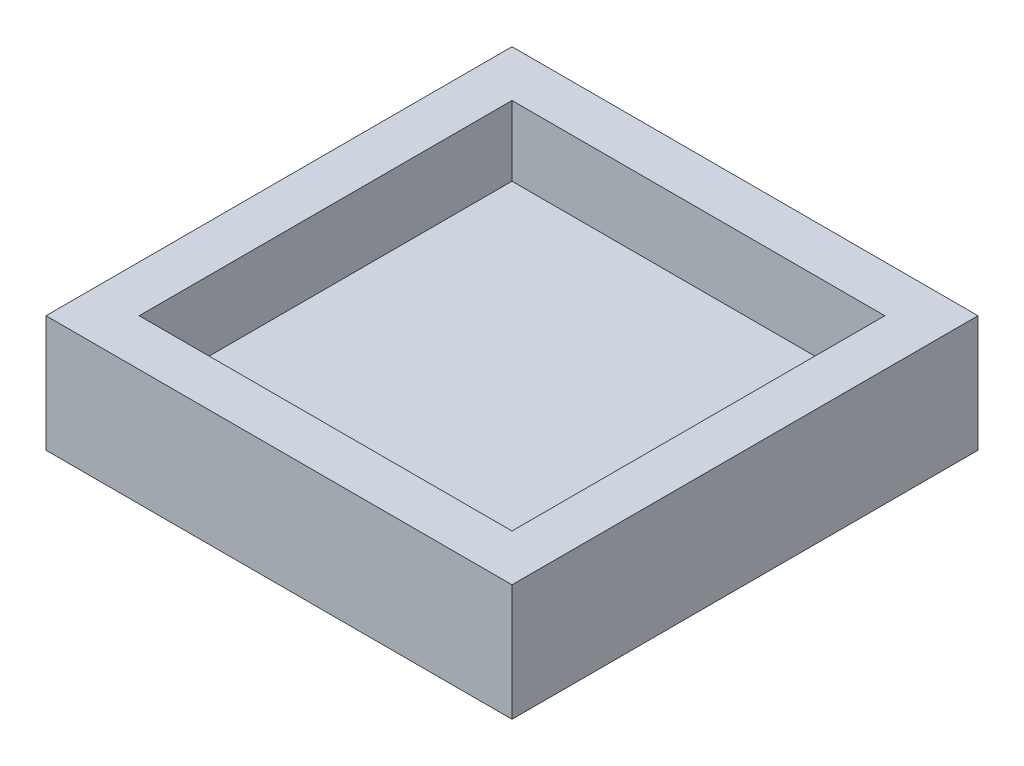
ISO-10303-21;
HEADER;
FILE_DESCRIPTION(('STEP AP214'),'2;1');
FILE_NAME('part.step','',(''),(''),'','','');
FILE_SCHEMA(('AUTOMOTIVE_DESIGN { 1 0 10303 214 1 1 1 1 }'));
ENDSEC;
DATA;
#1=APPLICATION_CONTEXT('core data for automotive mechanical design processes');
#2=APPLICATION_PROTOCOL_DEFINITION('international standard','automotive_design',2000,#1);
#3=PRODUCT_CONTEXT('',#1,'mechanical');
#4=PRODUCT('Part','Part','',(#3));
#5=PRODUCT_RELATED_PRODUCT_CATEGORY('part','',(#4));
#6=PRODUCT_DEFINITION_FORMATION('','',#4);
#7=PRODUCT_DEFINITION_CONTEXT('part definition',#1,'design');
#8=PRODUCT_DEFINITION('design','',#6,#7);
#9=PRODUCT_DEFINITION_SHAPE('','',#8);
#10=(LENGTH_UNIT() NAMED_UNIT(*) SI_UNIT(.MILLI.,.METRE.));
#11=(NAMED_UNIT(*) PLANE_ANGLE_UNIT() SI_UNIT($,.RADIAN.));
#12=(NAMED_UNIT(*) SI_UNIT($,.STERADIAN.) SOLID_ANGLE_UNIT());
#13=UNCERTAINTY_MEASURE_WITH_UNIT(LENGTH_MEASURE(1.E-05),#10,'distance_accuracy_value','');
#14=(GEOMETRIC_REPRESENTATION_CONTEXT(3) GLOBAL_UNCERTAINTY_ASSIGNED_CONTEXT((#13)) GLOBAL_UNIT_ASSIGNED_CONTEXT((#10,
#11,#12)) REPRESENTATION_CONTEXT('',''));
#15=CARTESIAN_POINT('',(0.,0.,0.));
#16=DIRECTION('',(0.,0.,1.));
#17=DIRECTION('',(1.,0.,0.));
#18=AXIS2_PLACEMENT_3D('',#15,#16,#17);
#19=CARTESIAN_POINT('',(0.,6.35,0.));
#20=DIRECTION('',(0.,0.,-1.));
#21=DIRECTION('',(-1.,0.,0.));
#22=AXIS2_PLACEMENT_3D('',#19,#20,#21);
#23=PLANE('',#22);
#24=DIRECTION('',(1.,0.,0.));
#25=VECTOR('',#24,1.);
#26=CARTESIAN_POINT('',(0.,0.,0.));
#27=LINE('',#26,#25);
#28=CARTESIAN_POINT('',(0.,0.,0.));
#29=VERTEX_POINT('',#28);
#30=CARTESIAN_POINT('',(25.4,0.,0.));
#31=VERTEX_POINT('',#30);
#32=EDGE_CURVE('E156',#29,#31,#27,.T.);
#33=ORIENTED_EDGE('',*,*,#32,.T.);
#34=DIRECTION('',(0.,-1.,0.));
#35=VECTOR('',#34,1.);
#36=CARTESIAN_POINT('',(25.4,6.35,0.));
#37=LINE('',#36,#35);
#38=CARTESIAN_POINT('',(25.4,6.35,0.));
#39=VERTEX_POINT('',#38);
#40=EDGE_CURVE('E11',#39,#31,#37,.T.);
#41=ORIENTED_EDGE('',*,*,#40,.F.);
#42=DIRECTION('',(1.,0.,0.));
#43=VECTOR('',#42,1.);
#44=CARTESIAN_POINT('',(0.,6.35,0.));
#45=LINE('',#44,#43);
#46=CARTESIAN_POINT('',(0.,6.35,0.));
#47=VERTEX_POINT('',#46);
#48=EDGE_CURVE('E150',#47,#39,#45,.T.);
#49=ORIENTED_EDGE('',*,*,#48,.F.);
#50=DIRECTION('',(0.,-1.,0.));
#51=VECTOR('',#50,1.);
#52=CARTESIAN_POINT('',(0.,6.35,0.));
#53=LINE('',#52,#51);
#54=EDGE_CURVE('E65',#47,#29,#53,.T.);
#55=ORIENTED_EDGE('',*,*,#54,.T.);
#56=EDGE_LOOP('',(#33,#41,#49,#55));
#57=FACE_BOUND('',#56,.T.);
#58=ADVANCED_FACE('F39',(#57),#23,.F.);
#59=CARTESIAN_POINT('',(25.4,6.35,0.));
#60=DIRECTION('',(-1.,0.,0.));
#61=DIRECTION('',(0.,0.,1.));
#62=AXIS2_PLACEMENT_3D('',#59,#60,#61);
#63=PLANE('',#62);
#64=DIRECTION('',(0.,0.,-1.));
#65=VECTOR('',#64,1.);
#66=CARTESIAN_POINT('',(25.4,0.,0.));
#67=LINE('',#66,#65);
#68=CARTESIAN_POINT('',(25.4,0.,-25.4));
#69=VERTEX_POINT('',#68);
#70=EDGE_CURVE('E158',#31,#69,#67,.T.);
#71=ORIENTED_EDGE('',*,*,#70,.T.);
#72=DIRECTION('',(0.,-1.,0.));
#73=VECTOR('',#72,1.);
#74=CARTESIAN_POINT('',(25.4,6.35,-25.4));
#75=LINE('',#74,#73);
#76=CARTESIAN_POINT('',(25.4,6.35,-25.4));
#77=VERTEX_POINT('',#76);
#78=EDGE_CURVE('E46',#77,#69,#75,.T.);
#79=ORIENTED_EDGE('',*,*,#78,.F.);
#80=DIRECTION('',(0.,0.,-1.));
#81=VECTOR('',#80,1.);
#82=CARTESIAN_POINT('',(25.4,6.35,0.));
#83=LINE('',#82,#81);
#84=EDGE_CURVE('E86',#39,#77,#83,.T.);
#85=ORIENTED_EDGE('',*,*,#84,.F.);
#86=ORIENTED_EDGE('',*,*,#40,.T.);
#87=EDGE_LOOP('',(#71,#79,#85,#86));
#88=FACE_BOUND('',#87,.T.);
#89=ADVANCED_FACE('F175',(#88),#63,.F.);
#90=CARTESIAN_POINT('',(0.,6.35,-25.4));
#91=DIRECTION('',(0.,0.,-1.));
#92=DIRECTION('',(-1.,0.,0.));
#93=AXIS2_PLACEMENT_3D('',#90,#91,#92);
#94=PLANE('',#93);
#95=DIRECTION('',(1.,0.,0.));
#96=VECTOR('',#95,1.);
#97=CARTESIAN_POINT('',(0.,0.,-25.4));
#98=LINE('',#97,#96);
#99=CARTESIAN_POINT('',(0.,0.,-25.4));
#100=VERTEX_POINT('',#99);
#101=EDGE_CURVE('E161',#100,#69,#98,.T.);
#102=ORIENTED_EDGE('',*,*,#101,.F.);
#103=DIRECTION('',(0.,-1.,0.));
#104=VECTOR('',#103,1.);
#105=CARTESIAN_POINT('',(0.,6.35,-25.4));
#106=LINE('',#105,#104);
#107=CARTESIAN_POINT('',(0.,6.35,-25.4));
#108=VERTEX_POINT('',#107);
#109=EDGE_CURVE('E170',#108,#100,#106,.T.);
#110=ORIENTED_EDGE('',*,*,#109,.F.);
#111=DIRECTION('',(1.,0.,0.));
#112=VECTOR('',#111,1.);
#113=CARTESIAN_POINT('',(0.,6.35,-25.4));
#114=LINE('',#113,#112);
#115=EDGE_CURVE('E151',#108,#77,#114,.T.);
#116=ORIENTED_EDGE('',*,*,#115,.T.);
#117=ORIENTED_EDGE('',*,*,#78,.T.);
#118=EDGE_LOOP('',(#102,#110,#116,#117));
#119=FACE_BOUND('',#118,.T.);
#120=ADVANCED_FACE('F168',(#119),#94,.T.);
#121=CARTESIAN_POINT('',(0.,6.35,0.));
#122=DIRECTION('',(-1.,0.,0.));
#123=DIRECTION('',(0.,0.,1.));
#124=AXIS2_PLACEMENT_3D('',#121,#122,#123);
#125=PLANE('',#124);
#126=DIRECTION('',(0.,0.,-1.));
#127=VECTOR('',#126,1.);
#128=CARTESIAN_POINT('',(0.,0.,0.));
#129=LINE('',#128,#127);
#130=EDGE_CURVE('E149',#29,#100,#129,.T.);
#131=ORIENTED_EDGE('',*,*,#130,.F.);
#132=ORIENTED_EDGE('',*,*,#54,.F.);
#133=DIRECTION('',(0.,0.,-1.));
#134=VECTOR('',#133,1.);
#135=CARTESIAN_POINT('',(0.,6.35,0.));
#136=LINE('',#135,#134);
#137=EDGE_CURVE('E152',#47,#108,#136,.T.);
#138=ORIENTED_EDGE('',*,*,#137,.T.);
#139=ORIENTED_EDGE('',*,*,#109,.T.);
#140=EDGE_LOOP('',(#131,#132,#138,#139));
#141=FACE_BOUND('',#140,.T.);
#142=ADVANCED_FACE('F176',(#141),#125,.T.);
#143=CARTESIAN_POINT('',(0.,6.35,0.));
#144=DIRECTION('',(0.,1.,0.));
#145=DIRECTION('',(0.,0.,1.));
#146=AXIS2_PLACEMENT_3D('',#143,#144,#145);
#147=PLANE('',#146);
#148=DIRECTION('',(1.,0.,0.));
#149=VECTOR('',#148,1.);
#150=CARTESIAN_POINT('',(0.,6.35,-2.54));
#151=LINE('',#150,#149);
#152=CARTESIAN_POINT('',(2.54,6.35,-2.54));
#153=VERTEX_POINT('',#152);
#154=CARTESIAN_POINT('',(22.86,6.35,-2.54));
#155=VERTEX_POINT('',#154);
#156=EDGE_CURVE('E137',#153,#155,#151,.T.);
#157=ORIENTED_EDGE('',*,*,#156,.F.);
#158=DIRECTION('',(0.,0.,-1.));
#159=VECTOR('',#158,1.);
#160=CARTESIAN_POINT('',(2.54,6.35,0.));
#161=LINE('',#160,#159);
#162=CARTESIAN_POINT('',(2.54,6.35,-22.86));
#163=VERTEX_POINT('',#162);
#164=EDGE_CURVE('E119',#153,#163,#161,.T.);
#165=ORIENTED_EDGE('',*,*,#164,.T.);
#166=DIRECTION('',(1.,0.,0.));
#167=VECTOR('',#166,1.);
#168=CARTESIAN_POINT('',(0.,6.35,-22.86));
#169=LINE('',#168,#167);
#170=CARTESIAN_POINT('',(22.86,6.35,-22.86));
#171=VERTEX_POINT('',#170);
#172=EDGE_CURVE('E52',#163,#171,#169,.T.);
#173=ORIENTED_EDGE('',*,*,#172,.T.);
#174=DIRECTION('',(0.,0.,-1.));
#175=VECTOR('',#174,1.);
#176=CARTESIAN_POINT('',(22.86,6.35,0.));
#177=LINE('',#176,#175);
#178=EDGE_CURVE('E138',#155,#171,#177,.T.);
#179=ORIENTED_EDGE('',*,*,#178,.F.);
#180=EDGE_LOOP('',(#157,#165,#173,#179));
#181=FACE_BOUND('',#180,.T.);
#182=ORIENTED_EDGE('',*,*,#48,.T.);
#183=ORIENTED_EDGE('',*,*,#84,.T.);
#184=ORIENTED_EDGE('',*,*,#115,.F.);
#185=ORIENTED_EDGE('',*,*,#137,.F.);
#186=EDGE_LOOP('',(#182,#183,#184,#185));
#187=FACE_BOUND('',#186,.T.);
#188=ADVANCED_FACE('F178',(#181,#187),#147,.T.);
#189=CARTESIAN_POINT('',(0.,0.,0.));
#190=DIRECTION('',(0.,1.,0.));
#191=DIRECTION('',(0.,0.,1.));
#192=AXIS2_PLACEMENT_3D('',#189,#190,#191);
#193=PLANE('',#192);
#194=ORIENTED_EDGE('',*,*,#32,.F.);
#195=ORIENTED_EDGE('',*,*,#130,.T.);
#196=ORIENTED_EDGE('',*,*,#101,.T.);
#197=ORIENTED_EDGE('',*,*,#70,.F.);
#198=EDGE_LOOP('',(#194,#195,#196,#197));
#199=FACE_BOUND('',#198,.T.);
#200=ADVANCED_FACE('F173',(#199),#193,.F.);
#201=CARTESIAN_POINT('',(0.,6.35,-2.54));
#202=DIRECTION('',(0.,0.,-1.));
#203=DIRECTION('',(-1.,0.,0.));
#204=AXIS2_PLACEMENT_3D('',#201,#202,#203);
#205=PLANE('',#204);
#206=DIRECTION('',(1.,0.,0.));
#207=VECTOR('',#206,1.);
#208=CARTESIAN_POINT('',(0.,2.54,-2.54));
#209=LINE('',#208,#207);
#210=CARTESIAN_POINT('',(2.54,2.54,-2.54));
#211=VERTEX_POINT('',#210);
#212=CARTESIAN_POINT('',(22.86,2.54,-2.54));
#213=VERTEX_POINT('',#212);
#214=EDGE_CURVE('E125',#211,#213,#209,.T.);
#215=ORIENTED_EDGE('',*,*,#214,.F.);
#216=DIRECTION('',(0.,-1.,0.));
#217=VECTOR('',#216,1.);
#218=CARTESIAN_POINT('',(2.54,6.35,-2.54));
#219=LINE('',#218,#217);
#220=EDGE_CURVE('E115',#153,#211,#219,.T.);
#221=ORIENTED_EDGE('',*,*,#220,.F.);
#222=ORIENTED_EDGE('',*,*,#156,.T.);
#223=DIRECTION('',(0.,-1.,0.));
#224=VECTOR('',#223,1.);
#225=CARTESIAN_POINT('',(22.86,6.35,-2.54));
#226=LINE('',#225,#224);
#227=EDGE_CURVE('E126',#155,#213,#226,.T.);
#228=ORIENTED_EDGE('',*,*,#227,.T.);
#229=EDGE_LOOP('',(#215,#221,#222,#228));
#230=FACE_BOUND('',#229,.T.);
#231=ADVANCED_FACE('F127',(#230),#205,.T.);
#232=CARTESIAN_POINT('',(22.86,6.35,0.));
#233=DIRECTION('',(-1.,0.,0.));
#234=DIRECTION('',(0.,0.,1.));
#235=AXIS2_PLACEMENT_3D('',#232,#233,#234);
#236=PLANE('',#235);
#237=DIRECTION('',(0.,0.,-1.));
#238=VECTOR('',#237,1.);
#239=CARTESIAN_POINT('',(22.86,2.54,0.));
#240=LINE('',#239,#238);
#241=CARTESIAN_POINT('',(22.86,2.54,-22.86));
#242=VERTEX_POINT('',#241);
#243=EDGE_CURVE('E132',#213,#242,#240,.T.);
#244=ORIENTED_EDGE('',*,*,#243,.F.);
#245=ORIENTED_EDGE('',*,*,#227,.F.);
#246=ORIENTED_EDGE('',*,*,#178,.T.);
#247=DIRECTION('',(0.,-1.,0.));
#248=VECTOR('',#247,1.);
#249=CARTESIAN_POINT('',(22.86,6.35,-22.86));
#250=LINE('',#249,#248);
#251=EDGE_CURVE('E271',#171,#242,#250,.T.);
#252=ORIENTED_EDGE('',*,*,#251,.T.);
#253=EDGE_LOOP('',(#244,#245,#246,#252));
#254=FACE_BOUND('',#253,.T.);
#255=ADVANCED_FACE('F201',(#254),#236,.T.);
#256=CARTESIAN_POINT('',(0.,6.35,-22.86));
#257=DIRECTION('',(0.,0.,-1.));
#258=DIRECTION('',(-1.,0.,0.));
#259=AXIS2_PLACEMENT_3D('',#256,#257,#258);
#260=PLANE('',#259);
#261=DIRECTION('',(1.,0.,0.));
#262=VECTOR('',#261,1.);
#263=CARTESIAN_POINT('',(0.,2.54,-22.86));
#264=LINE('',#263,#262);
#265=CARTESIAN_POINT('',(2.54,2.54,-22.86));
#266=VERTEX_POINT('',#265);
#267=EDGE_CURVE('E136',#266,#242,#264,.T.);
#268=ORIENTED_EDGE('',*,*,#267,.T.);
#269=ORIENTED_EDGE('',*,*,#251,.F.);
#270=ORIENTED_EDGE('',*,*,#172,.F.);
#271=DIRECTION('',(0.,-1.,0.));
#272=VECTOR('',#271,1.);
#273=CARTESIAN_POINT('',(2.54,6.35,-22.86));
#274=LINE('',#273,#272);
#275=EDGE_CURVE('E121',#163,#266,#274,.T.);
#276=ORIENTED_EDGE('',*,*,#275,.T.);
#277=EDGE_LOOP('',(#268,#269,#270,#276));
#278=FACE_BOUND('',#277,.T.);
#279=ADVANCED_FACE('F199',(#278),#260,.F.);
#280=CARTESIAN_POINT('',(2.54,6.35,0.));
#281=DIRECTION('',(-1.,0.,0.));
#282=DIRECTION('',(0.,0.,1.));
#283=AXIS2_PLACEMENT_3D('',#280,#281,#282);
#284=PLANE('',#283);
#285=DIRECTION('',(0.,0.,-1.));
#286=VECTOR('',#285,1.);
#287=CARTESIAN_POINT('',(2.54,2.54,0.));
#288=LINE('',#287,#286);
#289=EDGE_CURVE('E117',#211,#266,#288,.T.);
#290=ORIENTED_EDGE('',*,*,#289,.T.);
#291=ORIENTED_EDGE('',*,*,#275,.F.);
#292=ORIENTED_EDGE('',*,*,#164,.F.);
#293=ORIENTED_EDGE('',*,*,#220,.T.);
#294=EDGE_LOOP('',(#290,#291,#292,#293));
#295=FACE_BOUND('',#294,.T.);
#296=ADVANCED_FACE('F111',(#295),#284,.F.);
#297=CARTESIAN_POINT('',(0.,2.54,0.));
#298=DIRECTION('',(0.,1.,0.));
#299=DIRECTION('',(0.,0.,1.));
#300=AXIS2_PLACEMENT_3D('',#297,#298,#299);
#301=PLANE('',#300);
#302=ORIENTED_EDGE('',*,*,#214,.T.);
#303=ORIENTED_EDGE('',*,*,#243,.T.);
#304=ORIENTED_EDGE('',*,*,#267,.F.);
#305=ORIENTED_EDGE('',*,*,#289,.F.);
#306=EDGE_LOOP('',(#302,#303,#304,#305));
#307=FACE_BOUND('',#306,.T.);
#308=ADVANCED_FACE('F131',(#307),#301,.T.);
#309=CLOSED_SHELL('',(#58,#89,#120,#142,#188,#200,#231,#255,#279,#296,#308));
#310=MANIFOLD_SOLID_BREP('B2',#309);
#311=ADVANCED_BREP_SHAPE_REPRESENTATION('',(#18,#310),#14);
#312=SHAPE_DEFINITION_REPRESENTATION(#9,#311);
ENDSEC;
END-ISO-10303-21;
